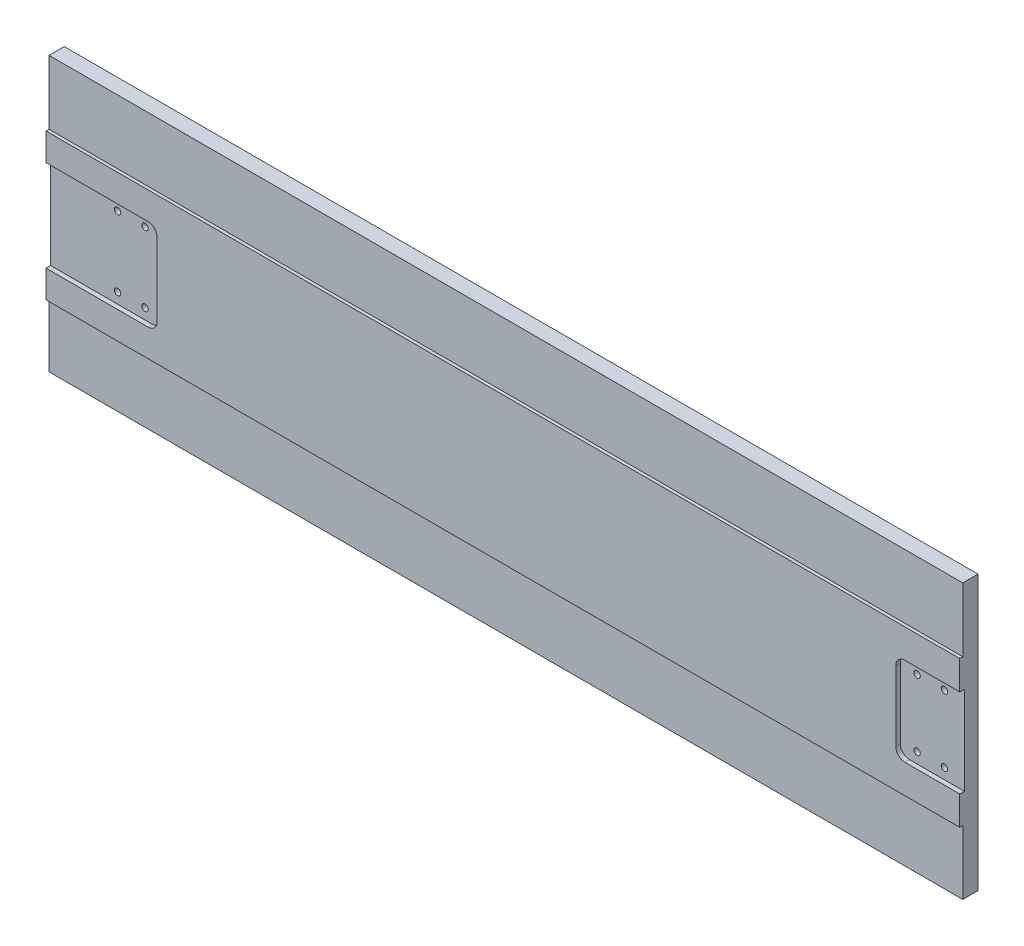
ISO-10303-21;
HEADER;
FILE_DESCRIPTION(('STEP AP214'),'2;1');
FILE_NAME('part.step','',(''),(''),'','','');
FILE_SCHEMA(('AUTOMOTIVE_DESIGN { 1 0 10303 214 1 1 1 1 }'));
ENDSEC;
DATA;
#1=APPLICATION_CONTEXT('core data for automotive mechanical design processes');
#2=APPLICATION_PROTOCOL_DEFINITION('international standard','automotive_design',2000,#1);
#3=PRODUCT_CONTEXT('',#1,'mechanical');
#4=PRODUCT('Part','Part','',(#3));
#5=PRODUCT_RELATED_PRODUCT_CATEGORY('part','',(#4));
#6=PRODUCT_DEFINITION_FORMATION('','',#4);
#7=PRODUCT_DEFINITION_CONTEXT('part definition',#1,'design');
#8=PRODUCT_DEFINITION('design','',#6,#7);
#9=PRODUCT_DEFINITION_SHAPE('','',#8);
#10=(LENGTH_UNIT() NAMED_UNIT(*) SI_UNIT(.MILLI.,.METRE.));
#11=(NAMED_UNIT(*) PLANE_ANGLE_UNIT() SI_UNIT($,.RADIAN.));
#12=(NAMED_UNIT(*) SI_UNIT($,.STERADIAN.) SOLID_ANGLE_UNIT());
#13=UNCERTAINTY_MEASURE_WITH_UNIT(LENGTH_MEASURE(1.E-05),#10,'distance_accuracy_value','');
#14=(GEOMETRIC_REPRESENTATION_CONTEXT(3) GLOBAL_UNCERTAINTY_ASSIGNED_CONTEXT((#13)) GLOBAL_UNIT_ASSIGNED_CONTEXT((#10,
#11,#12)) REPRESENTATION_CONTEXT('',''));
#15=CARTESIAN_POINT('',(0.,0.,0.));
#16=DIRECTION('',(0.,0.,1.));
#17=DIRECTION('',(1.,0.,0.));
#18=AXIS2_PLACEMENT_3D('',#15,#16,#17);
#19=CARTESIAN_POINT('',(0.,270.,10.));
#20=DIRECTION('',(0.,0.,1.));
#21=DIRECTION('',(1.,0.,0.));
#22=AXIS2_PLACEMENT_3D('',#19,#20,#21);
#23=PLANE('',#22);
#24=DIRECTION('',(-1.,0.,0.));
#25=VECTOR('',#24,1.);
#26=CARTESIAN_POINT('',(0.,408.,10.));
#27=LINE('',#26,#25);
#28=CARTESIAN_POINT('',(600.,408.,10.));
#29=VERTEX_POINT('',#28);
#30=CARTESIAN_POINT('',(0.,408.,10.));
#31=VERTEX_POINT('',#30);
#32=EDGE_CURVE('E247',#29,#31,#27,.T.);
#33=ORIENTED_EDGE('',*,*,#32,.F.);
#34=DIRECTION('',(0.,1.,0.));
#35=VECTOR('',#34,1.);
#36=CARTESIAN_POINT('',(600.,450.,10.));
#37=LINE('',#36,#35);
#38=CARTESIAN_POINT('',(600.,450.,10.));
#39=VERTEX_POINT('',#38);
#40=EDGE_CURVE('E248',#29,#39,#37,.T.);
#41=ORIENTED_EDGE('',*,*,#40,.T.);
#42=DIRECTION('',(-1.,0.,0.));
#43=VECTOR('',#42,1.);
#44=CARTESIAN_POINT('',(0.,450.,10.));
#45=LINE('',#44,#43);
#46=CARTESIAN_POINT('',(0.,450.,10.));
#47=VERTEX_POINT('',#46);
#48=EDGE_CURVE('E445',#39,#47,#45,.T.);
#49=ORIENTED_EDGE('',*,*,#48,.T.);
#50=DIRECTION('',(0.,-1.,0.));
#51=VECTOR('',#50,1.);
#52=CARTESIAN_POINT('',(0.,450.,10.));
#53=LINE('',#52,#51);
#54=EDGE_CURVE('E459',#47,#31,#53,.T.);
#55=ORIENTED_EDGE('',*,*,#54,.T.);
#56=EDGE_LOOP('',(#33,#41,#49,#55));
#57=FACE_BOUND('',#56,.T.);
#58=ADVANCED_FACE('F33',(#57),#23,.T.);
#59=CARTESIAN_POINT('',(0.,450.,10.));
#60=DIRECTION('',(1.,0.,0.));
#61=DIRECTION('',(0.,1.,0.));
#62=AXIS2_PLACEMENT_3D('',#59,#60,#61);
#63=PLANE('',#62);
#64=DIRECTION('',(0.,-1.,0.));
#65=VECTOR('',#64,1.);
#66=CARTESIAN_POINT('',(0.,390.,9.));
#67=LINE('',#66,#65);
#68=CARTESIAN_POINT('',(0.,390.,9.));
#69=VERTEX_POINT('',#68);
#70=CARTESIAN_POINT('',(0.,330.,9.));
#71=VERTEX_POINT('',#70);
#72=EDGE_CURVE('E204',#69,#71,#67,.T.);
#73=ORIENTED_EDGE('',*,*,#72,.F.);
#74=DIRECTION('',(0.,0.,1.));
#75=VECTOR('',#74,1.);
#76=CARTESIAN_POINT('',(0.,390.,9.));
#77=LINE('',#76,#75);
#78=CARTESIAN_POINT('',(0.,390.,12.));
#79=VERTEX_POINT('',#78);
#80=EDGE_CURVE('E222',#69,#79,#77,.T.);
#81=ORIENTED_EDGE('',*,*,#80,.T.);
#82=DIRECTION('',(0.,-1.,0.));
#83=VECTOR('',#82,1.);
#84=CARTESIAN_POINT('',(0.,408.,12.));
#85=LINE('',#84,#83);
#86=CARTESIAN_POINT('',(0.,408.,12.));
#87=VERTEX_POINT('',#86);
#88=EDGE_CURVE('E227',#87,#79,#85,.T.);
#89=ORIENTED_EDGE('',*,*,#88,.F.);
#90=DIRECTION('',(0.,0.,-1.));
#91=VECTOR('',#90,1.);
#92=CARTESIAN_POINT('',(0.,408.,12.));
#93=LINE('',#92,#91);
#94=EDGE_CURVE('E238',#87,#31,#93,.T.);
#95=ORIENTED_EDGE('',*,*,#94,.T.);
#96=ORIENTED_EDGE('',*,*,#54,.F.);
#97=DIRECTION('',(0.,0.,-1.));
#98=VECTOR('',#97,1.);
#99=CARTESIAN_POINT('',(0.,450.,10.));
#100=LINE('',#99,#98);
#101=CARTESIAN_POINT('',(0.,450.,0.));
#102=VERTEX_POINT('',#101);
#103=EDGE_CURVE('E450',#47,#102,#100,.T.);
#104=ORIENTED_EDGE('',*,*,#103,.T.);
#105=DIRECTION('',(0.,-1.,0.));
#106=VECTOR('',#105,1.);
#107=CARTESIAN_POINT('',(0.,450.,0.));
#108=LINE('',#107,#106);
#109=CARTESIAN_POINT('',(0.,270.,0.));
#110=VERTEX_POINT('',#109);
#111=EDGE_CURVE('E260',#102,#110,#108,.T.);
#112=ORIENTED_EDGE('',*,*,#111,.T.);
#113=DIRECTION('',(0.,0.,-1.));
#114=VECTOR('',#113,1.);
#115=CARTESIAN_POINT('',(0.,270.,10.));
#116=LINE('',#115,#114);
#117=CARTESIAN_POINT('',(0.,270.,10.));
#118=VERTEX_POINT('',#117);
#119=EDGE_CURVE('E277',#118,#110,#116,.T.);
#120=ORIENTED_EDGE('',*,*,#119,.F.);
#121=CARTESIAN_POINT('',(0.,312.,10.));
#122=VERTEX_POINT('',#121);
#123=EDGE_CURVE('E449',#122,#118,#53,.T.);
#124=ORIENTED_EDGE('',*,*,#123,.F.);
#125=DIRECTION('',(0.,0.,-1.));
#126=VECTOR('',#125,1.);
#127=CARTESIAN_POINT('',(0.,312.,12.));
#128=LINE('',#127,#126);
#129=CARTESIAN_POINT('',(0.,312.,12.));
#130=VERTEX_POINT('',#129);
#131=EDGE_CURVE('E254',#130,#122,#128,.T.);
#132=ORIENTED_EDGE('',*,*,#131,.F.);
#133=CARTESIAN_POINT('',(0.,330.,12.));
#134=VERTEX_POINT('',#133);
#135=EDGE_CURVE('E231',#134,#130,#85,.T.);
#136=ORIENTED_EDGE('',*,*,#135,.F.);
#137=DIRECTION('',(0.,0.,1.));
#138=VECTOR('',#137,1.);
#139=CARTESIAN_POINT('',(0.,330.,9.));
#140=LINE('',#139,#138);
#141=EDGE_CURVE('E215',#71,#134,#140,.T.);
#142=ORIENTED_EDGE('',*,*,#141,.F.);
#143=EDGE_LOOP('',(#73,#81,#89,#95,#96,#104,#112,#120,#124,#132,#136,#142));
#144=FACE_BOUND('',#143,.T.);
#145=ADVANCED_FACE('F329',(#144),#63,.F.);
#146=CARTESIAN_POINT('',(0.,270.,10.));
#147=DIRECTION('',(0.,1.,0.));
#148=DIRECTION('',(0.,0.,1.));
#149=AXIS2_PLACEMENT_3D('',#146,#147,#148);
#150=PLANE('',#149);
#151=DIRECTION('',(1.,0.,0.));
#152=VECTOR('',#151,1.);
#153=CARTESIAN_POINT('',(0.,270.,0.));
#154=LINE('',#153,#152);
#155=CARTESIAN_POINT('',(600.,270.,0.));
#156=VERTEX_POINT('',#155);
#157=EDGE_CURVE('E437',#110,#156,#154,.T.);
#158=ORIENTED_EDGE('',*,*,#157,.T.);
#159=DIRECTION('',(0.,0.,-1.));
#160=VECTOR('',#159,1.);
#161=CARTESIAN_POINT('',(600.,270.,10.));
#162=LINE('',#161,#160);
#163=CARTESIAN_POINT('',(600.,270.,10.));
#164=VERTEX_POINT('',#163);
#165=EDGE_CURVE('E455',#164,#156,#162,.T.);
#166=ORIENTED_EDGE('',*,*,#165,.F.);
#167=DIRECTION('',(1.,0.,0.));
#168=VECTOR('',#167,1.);
#169=CARTESIAN_POINT('',(0.,270.,10.));
#170=LINE('',#169,#168);
#171=EDGE_CURVE('E461',#118,#164,#170,.T.);
#172=ORIENTED_EDGE('',*,*,#171,.F.);
#173=ORIENTED_EDGE('',*,*,#119,.T.);
#174=EDGE_LOOP('',(#158,#166,#172,#173));
#175=FACE_BOUND('',#174,.T.);
#176=ADVANCED_FACE('F491',(#175),#150,.F.);
#177=CARTESIAN_POINT('',(600.,450.,10.));
#178=DIRECTION('',(-1.,0.,0.));
#179=DIRECTION('',(0.,0.,1.));
#180=AXIS2_PLACEMENT_3D('',#177,#178,#179);
#181=PLANE('',#180);
#182=DIRECTION('',(0.,1.,0.));
#183=VECTOR('',#182,1.);
#184=CARTESIAN_POINT('',(600.,331.,9.));
#185=LINE('',#184,#183);
#186=CARTESIAN_POINT('',(600.,331.,9.));
#187=VERTEX_POINT('',#186);
#188=CARTESIAN_POINT('',(600.,389.,9.));
#189=VERTEX_POINT('',#188);
#190=EDGE_CURVE('E181',#187,#189,#185,.T.);
#191=ORIENTED_EDGE('',*,*,#190,.F.);
#192=DIRECTION('',(0.,0.,1.));
#193=VECTOR('',#192,1.);
#194=CARTESIAN_POINT('',(600.,331.,9.));
#195=LINE('',#194,#193);
#196=CARTESIAN_POINT('',(600.,331.,12.));
#197=VERTEX_POINT('',#196);
#198=EDGE_CURVE('E197',#187,#197,#195,.T.);
#199=ORIENTED_EDGE('',*,*,#198,.T.);
#200=DIRECTION('',(0.,1.,0.));
#201=VECTOR('',#200,1.);
#202=CARTESIAN_POINT('',(600.,408.,12.));
#203=LINE('',#202,#201);
#204=CARTESIAN_POINT('',(600.,312.,12.));
#205=VERTEX_POINT('',#204);
#206=EDGE_CURVE('E233',#205,#197,#203,.T.);
#207=ORIENTED_EDGE('',*,*,#206,.F.);
#208=DIRECTION('',(0.,0.,-1.));
#209=VECTOR('',#208,1.);
#210=CARTESIAN_POINT('',(600.,312.,12.));
#211=LINE('',#210,#209);
#212=CARTESIAN_POINT('',(600.,312.,10.));
#213=VERTEX_POINT('',#212);
#214=EDGE_CURVE('E251',#205,#213,#211,.T.);
#215=ORIENTED_EDGE('',*,*,#214,.T.);
#216=EDGE_CURVE('E467',#164,#213,#37,.T.);
#217=ORIENTED_EDGE('',*,*,#216,.F.);
#218=ORIENTED_EDGE('',*,*,#165,.T.);
#219=DIRECTION('',(0.,1.,0.));
#220=VECTOR('',#219,1.);
#221=CARTESIAN_POINT('',(600.,450.,0.));
#222=LINE('',#221,#220);
#223=CARTESIAN_POINT('',(600.,450.,0.));
#224=VERTEX_POINT('',#223);
#225=EDGE_CURVE('E442',#156,#224,#222,.T.);
#226=ORIENTED_EDGE('',*,*,#225,.T.);
#227=DIRECTION('',(0.,0.,-1.));
#228=VECTOR('',#227,1.);
#229=CARTESIAN_POINT('',(600.,450.,10.));
#230=LINE('',#229,#228);
#231=EDGE_CURVE('E452',#39,#224,#230,.T.);
#232=ORIENTED_EDGE('',*,*,#231,.F.);
#233=ORIENTED_EDGE('',*,*,#40,.F.);
#234=DIRECTION('',(0.,0.,-1.));
#235=VECTOR('',#234,1.);
#236=CARTESIAN_POINT('',(600.,408.,12.));
#237=LINE('',#236,#235);
#238=CARTESIAN_POINT('',(600.,408.,12.));
#239=VERTEX_POINT('',#238);
#240=EDGE_CURVE('E255',#239,#29,#237,.T.);
#241=ORIENTED_EDGE('',*,*,#240,.F.);
#242=CARTESIAN_POINT('',(600.,389.,12.));
#243=VERTEX_POINT('',#242);
#244=EDGE_CURVE('E196',#243,#239,#203,.T.);
#245=ORIENTED_EDGE('',*,*,#244,.F.);
#246=DIRECTION('',(0.,0.,1.));
#247=VECTOR('',#246,1.);
#248=CARTESIAN_POINT('',(600.,389.,9.));
#249=LINE('',#248,#247);
#250=EDGE_CURVE('E174',#189,#243,#249,.T.);
#251=ORIENTED_EDGE('',*,*,#250,.F.);
#252=EDGE_LOOP('',(#191,#199,#207,#215,#217,#218,#226,#232,#233,#241,#245,#251));
#253=FACE_BOUND('',#252,.T.);
#254=ADVANCED_FACE('F194',(#253),#181,.F.);
#255=CARTESIAN_POINT('',(0.,450.,10.));
#256=DIRECTION('',(0.,-1.,0.));
#257=DIRECTION('',(0.,0.,-1.));
#258=AXIS2_PLACEMENT_3D('',#255,#256,#257);
#259=PLANE('',#258);
#260=DIRECTION('',(-1.,0.,0.));
#261=VECTOR('',#260,1.);
#262=CARTESIAN_POINT('',(0.,450.,0.));
#263=LINE('',#262,#261);
#264=EDGE_CURVE('E436',#224,#102,#263,.T.);
#265=ORIENTED_EDGE('',*,*,#264,.T.);
#266=ORIENTED_EDGE('',*,*,#103,.F.);
#267=ORIENTED_EDGE('',*,*,#48,.F.);
#268=ORIENTED_EDGE('',*,*,#231,.T.);
#269=EDGE_LOOP('',(#265,#266,#267,#268));
#270=FACE_BOUND('',#269,.T.);
#271=ADVANCED_FACE('F475',(#270),#259,.F.);
#272=DIRECTION('',(1.,0.,0.));
#273=VECTOR('',#272,1.);
#274=CARTESIAN_POINT('',(0.,312.,10.));
#275=LINE('',#274,#273);
#276=EDGE_CURVE('E225',#122,#213,#275,.T.);
#277=ORIENTED_EDGE('',*,*,#276,.F.);
#278=ORIENTED_EDGE('',*,*,#123,.T.);
#279=ORIENTED_EDGE('',*,*,#171,.T.);
#280=ORIENTED_EDGE('',*,*,#216,.T.);
#281=EDGE_LOOP('',(#277,#278,#279,#280));
#282=FACE_BOUND('',#281,.T.);
#283=ADVANCED_FACE('F421',(#282),#23,.T.);
#284=CARTESIAN_POINT('',(0.,270.,0.));
#285=DIRECTION('',(0.,0.,1.));
#286=DIRECTION('',(1.,0.,0.));
#287=AXIS2_PLACEMENT_3D('',#284,#285,#286);
#288=PLANE('',#287);
#289=CARTESIAN_POINT('',(587.,382.,0.));
#290=DIRECTION('',(0.,0.,1.));
#291=DIRECTION('',(1.,0.,0.));
#292=AXIS2_PLACEMENT_3D('',#289,#290,#291);
#293=CIRCLE('',#292,2.09999999999999);
#294=CARTESIAN_POINT('',(589.1,382.,0.));
#295=VERTEX_POINT('',#294);
#296=EDGE_CURVE('E390',#295,#295,#293,.T.);
#297=ORIENTED_EDGE('',*,*,#296,.T.);
#298=EDGE_LOOP('',(#297));
#299=FACE_BOUND('',#298,.T.);
#300=CARTESIAN_POINT('',(569.,382.,0.));
#301=DIRECTION('',(0.,0.,1.));
#302=DIRECTION('',(1.,0.,0.));
#303=AXIS2_PLACEMENT_3D('',#300,#301,#302);
#304=CIRCLE('',#303,2.09999999999999);
#305=CARTESIAN_POINT('',(571.1,382.,0.));
#306=VERTEX_POINT('',#305);
#307=EDGE_CURVE('E384',#306,#306,#304,.T.);
#308=ORIENTED_EDGE('',*,*,#307,.T.);
#309=EDGE_LOOP('',(#308));
#310=FACE_BOUND('',#309,.T.);
#311=CARTESIAN_POINT('',(569.,338.,0.));
#312=DIRECTION('',(0.,0.,1.));
#313=DIRECTION('',(1.,0.,0.));
#314=AXIS2_PLACEMENT_3D('',#311,#312,#313);
#315=CIRCLE('',#314,2.09999999999999);
#316=CARTESIAN_POINT('',(571.1,338.,0.));
#317=VERTEX_POINT('',#316);
#318=EDGE_CURVE('E378',#317,#317,#315,.T.);
#319=ORIENTED_EDGE('',*,*,#318,.T.);
#320=EDGE_LOOP('',(#319));
#321=FACE_BOUND('',#320,.T.);
#322=CARTESIAN_POINT('',(587.,338.,0.));
#323=DIRECTION('',(0.,0.,1.));
#324=DIRECTION('',(1.,0.,0.));
#325=AXIS2_PLACEMENT_3D('',#322,#323,#324);
#326=CIRCLE('',#325,2.09999999999999);
#327=CARTESIAN_POINT('',(589.1,338.,0.));
#328=VERTEX_POINT('',#327);
#329=EDGE_CURVE('E372',#328,#328,#326,.T.);
#330=ORIENTED_EDGE('',*,*,#329,.T.);
#331=EDGE_LOOP('',(#330));
#332=FACE_BOUND('',#331,.T.);
#333=CARTESIAN_POINT('',(62.,383.,0.));
#334=DIRECTION('',(0.,0.,1.));
#335=DIRECTION('',(1.,0.,0.));
#336=AXIS2_PLACEMENT_3D('',#333,#334,#335);
#337=CIRCLE('',#336,2.09999999999999);
#338=CARTESIAN_POINT('',(64.1,383.,0.));
#339=VERTEX_POINT('',#338);
#340=EDGE_CURVE('E366',#339,#339,#337,.T.);
#341=ORIENTED_EDGE('',*,*,#340,.T.);
#342=EDGE_LOOP('',(#341));
#343=FACE_BOUND('',#342,.T.);
#344=CARTESIAN_POINT('',(44.,383.,0.));
#345=DIRECTION('',(0.,0.,1.));
#346=DIRECTION('',(1.,0.,0.));
#347=AXIS2_PLACEMENT_3D('',#344,#345,#346);
#348=CIRCLE('',#347,2.1);
#349=CARTESIAN_POINT('',(46.1,383.,0.));
#350=VERTEX_POINT('',#349);
#351=EDGE_CURVE('E360',#350,#350,#348,.T.);
#352=ORIENTED_EDGE('',*,*,#351,.T.);
#353=EDGE_LOOP('',(#352));
#354=FACE_BOUND('',#353,.T.);
#355=CARTESIAN_POINT('',(62.,337.,0.));
#356=DIRECTION('',(0.,0.,1.));
#357=DIRECTION('',(1.,0.,0.));
#358=AXIS2_PLACEMENT_3D('',#355,#356,#357);
#359=CIRCLE('',#358,2.1);
#360=CARTESIAN_POINT('',(64.1,337.,0.));
#361=VERTEX_POINT('',#360);
#362=EDGE_CURVE('E354',#361,#361,#359,.T.);
#363=ORIENTED_EDGE('',*,*,#362,.T.);
#364=EDGE_LOOP('',(#363));
#365=FACE_BOUND('',#364,.T.);
#366=CARTESIAN_POINT('',(44.,337.,0.));
#367=DIRECTION('',(0.,0.,1.));
#368=DIRECTION('',(1.,0.,0.));
#369=AXIS2_PLACEMENT_3D('',#366,#367,#368);
#370=CIRCLE('',#369,2.1);
#371=CARTESIAN_POINT('',(46.1,337.,0.));
#372=VERTEX_POINT('',#371);
#373=EDGE_CURVE('E346',#372,#372,#370,.T.);
#374=ORIENTED_EDGE('',*,*,#373,.T.);
#375=EDGE_LOOP('',(#374));
#376=FACE_BOUND('',#375,.T.);
#377=ORIENTED_EDGE('',*,*,#111,.F.);
#378=ORIENTED_EDGE('',*,*,#264,.F.);
#379=ORIENTED_EDGE('',*,*,#225,.F.);
#380=ORIENTED_EDGE('',*,*,#157,.F.);
#381=EDGE_LOOP('',(#377,#378,#379,#380));
#382=FACE_BOUND('',#381,.T.);
#383=ADVANCED_FACE('F418',(#299,#310,#321,#332,#343,#354,#365,#376,#382),#288,.F.);
#384=CARTESIAN_POINT('',(0.,312.,12.));
#385=DIRECTION('',(0.,1.,0.));
#386=DIRECTION('',(0.,0.,1.));
#387=AXIS2_PLACEMENT_3D('',#384,#385,#386);
#388=PLANE('',#387);
#389=ORIENTED_EDGE('',*,*,#276,.T.);
#390=ORIENTED_EDGE('',*,*,#214,.F.);
#391=DIRECTION('',(1.,0.,0.));
#392=VECTOR('',#391,1.);
#393=CARTESIAN_POINT('',(0.,312.,12.));
#394=LINE('',#393,#392);
#395=EDGE_CURVE('E230',#130,#205,#394,.T.);
#396=ORIENTED_EDGE('',*,*,#395,.F.);
#397=ORIENTED_EDGE('',*,*,#131,.T.);
#398=EDGE_LOOP('',(#389,#390,#396,#397));
#399=FACE_BOUND('',#398,.T.);
#400=ADVANCED_FACE('F336',(#399),#388,.F.);
#401=CARTESIAN_POINT('',(0.,408.,12.));
#402=DIRECTION('',(0.,-1.,0.));
#403=DIRECTION('',(1.,0.,0.));
#404=AXIS2_PLACEMENT_3D('',#401,#402,#403);
#405=PLANE('',#404);
#406=ORIENTED_EDGE('',*,*,#32,.T.);
#407=ORIENTED_EDGE('',*,*,#94,.F.);
#408=DIRECTION('',(-1.,0.,0.));
#409=VECTOR('',#408,1.);
#410=CARTESIAN_POINT('',(0.,408.,12.));
#411=LINE('',#410,#409);
#412=EDGE_CURVE('E236',#239,#87,#411,.T.);
#413=ORIENTED_EDGE('',*,*,#412,.F.);
#414=ORIENTED_EDGE('',*,*,#240,.T.);
#415=EDGE_LOOP('',(#406,#407,#413,#414));
#416=FACE_BOUND('',#415,.T.);
#417=ADVANCED_FACE('F477',(#416),#405,.F.);
#418=CARTESIAN_POINT('',(0.,0.,12.));
#419=DIRECTION('',(0.,0.,1.));
#420=DIRECTION('',(1.,0.,0.));
#421=AXIS2_PLACEMENT_3D('',#418,#419,#420);
#422=PLANE('',#421);
#423=DIRECTION('',(1.,0.,0.));
#424=VECTOR('',#423,1.);
#425=CARTESIAN_POINT('',(600.,331.,12.));
#426=LINE('',#425,#424);
#427=CARTESIAN_POINT('',(564.,331.,12.));
#428=VERTEX_POINT('',#427);
#429=EDGE_CURVE('E191',#428,#197,#426,.T.);
#430=ORIENTED_EDGE('',*,*,#429,.F.);
#431=CARTESIAN_POINT('',(564.,337.,12.));
#432=DIRECTION('',(0.,0.,1.));
#433=DIRECTION('',(1.,0.,0.));
#434=AXIS2_PLACEMENT_3D('',#431,#432,#433);
#435=CIRCLE('',#434,6.);
#436=CARTESIAN_POINT('',(558.,337.,12.));
#437=VERTEX_POINT('',#436);
#438=EDGE_CURVE('E299',#428,#437,#435,.F.);
#439=ORIENTED_EDGE('',*,*,#438,.T.);
#440=DIRECTION('',(0.,-1.,0.));
#441=VECTOR('',#440,1.);
#442=CARTESIAN_POINT('',(558.,331.,12.));
#443=LINE('',#442,#441);
#444=CARTESIAN_POINT('',(558.,383.,12.));
#445=VERTEX_POINT('',#444);
#446=EDGE_CURVE('E342',#445,#437,#443,.T.);
#447=ORIENTED_EDGE('',*,*,#446,.F.);
#448=CARTESIAN_POINT('',(564.,383.,12.));
#449=DIRECTION('',(0.,0.,1.));
#450=DIRECTION('',(1.,0.,0.));
#451=AXIS2_PLACEMENT_3D('',#448,#449,#450);
#452=CIRCLE('',#451,6.);
#453=CARTESIAN_POINT('',(564.,389.,12.));
#454=VERTEX_POINT('',#453);
#455=EDGE_CURVE('E301',#445,#454,#452,.F.);
#456=ORIENTED_EDGE('',*,*,#455,.T.);
#457=DIRECTION('',(-1.,0.,0.));
#458=VECTOR('',#457,1.);
#459=CARTESIAN_POINT('',(600.,389.,12.));
#460=LINE('',#459,#458);
#461=EDGE_CURVE('E343',#243,#454,#460,.T.);
#462=ORIENTED_EDGE('',*,*,#461,.F.);
#463=ORIENTED_EDGE('',*,*,#244,.T.);
#464=ORIENTED_EDGE('',*,*,#412,.T.);
#465=ORIENTED_EDGE('',*,*,#88,.T.);
#466=DIRECTION('',(-1.,0.,0.));
#467=VECTOR('',#466,1.);
#468=CARTESIAN_POINT('',(0.,390.,12.));
#469=LINE('',#468,#467);
#470=CARTESIAN_POINT('',(67.,390.,12.));
#471=VERTEX_POINT('',#470);
#472=EDGE_CURVE('E208',#471,#79,#469,.T.);
#473=ORIENTED_EDGE('',*,*,#472,.F.);
#474=CARTESIAN_POINT('',(67.,384.,12.));
#475=DIRECTION('',(0.,0.,1.));
#476=DIRECTION('',(1.,0.,0.));
#477=AXIS2_PLACEMENT_3D('',#474,#475,#476);
#478=CIRCLE('',#477,6.);
#479=CARTESIAN_POINT('',(73.,384.,12.));
#480=VERTEX_POINT('',#479);
#481=EDGE_CURVE('E11',#471,#480,#478,.F.);
#482=ORIENTED_EDGE('',*,*,#481,.T.);
#483=DIRECTION('',(0.,1.,0.));
#484=VECTOR('',#483,1.);
#485=CARTESIAN_POINT('',(73.,390.,12.));
#486=LINE('',#485,#484);
#487=CARTESIAN_POINT('',(73.,336.,12.));
#488=VERTEX_POINT('',#487);
#489=EDGE_CURVE('E218',#488,#480,#486,.T.);
#490=ORIENTED_EDGE('',*,*,#489,.F.);
#491=CARTESIAN_POINT('',(67.,336.,12.));
#492=DIRECTION('',(0.,0.,1.));
#493=DIRECTION('',(1.,0.,0.));
#494=AXIS2_PLACEMENT_3D('',#491,#492,#493);
#495=CIRCLE('',#494,6.);
#496=CARTESIAN_POINT('',(67.,330.,12.));
#497=VERTEX_POINT('',#496);
#498=EDGE_CURVE('E41',#488,#497,#495,.F.);
#499=ORIENTED_EDGE('',*,*,#498,.T.);
#500=DIRECTION('',(1.,0.,0.));
#501=VECTOR('',#500,1.);
#502=CARTESIAN_POINT('',(0.,330.,12.));
#503=LINE('',#502,#501);
#504=EDGE_CURVE('E199',#134,#497,#503,.T.);
#505=ORIENTED_EDGE('',*,*,#504,.F.);
#506=ORIENTED_EDGE('',*,*,#135,.T.);
#507=ORIENTED_EDGE('',*,*,#395,.T.);
#508=ORIENTED_EDGE('',*,*,#206,.T.);
#509=EDGE_LOOP('',(#430,#439,#447,#456,#462,#463,#464,#465,#473,#482,#490,#499,#505,#506,#507,#508));
#510=FACE_BOUND('',#509,.T.);
#511=ADVANCED_FACE('F306',(#510),#422,.T.);
#512=CARTESIAN_POINT('',(0.,390.,9.));
#513=DIRECTION('',(0.,1.,0.));
#514=DIRECTION('',(0.,0.,1.));
#515=AXIS2_PLACEMENT_3D('',#512,#513,#514);
#516=PLANE('',#515);
#517=DIRECTION('',(-1.,0.,0.));
#518=VECTOR('',#517,1.);
#519=CARTESIAN_POINT('',(0.,390.,9.));
#520=LINE('',#519,#518);
#521=CARTESIAN_POINT('',(67.,390.,9.));
#522=VERTEX_POINT('',#521);
#523=EDGE_CURVE('E213',#522,#69,#520,.T.);
#524=ORIENTED_EDGE('',*,*,#523,.F.);
#525=DIRECTION('',(0.,0.,1.));
#526=VECTOR('',#525,1.);
#527=CARTESIAN_POINT('',(67.,390.,12.));
#528=LINE('',#527,#526);
#529=EDGE_CURVE('E297',#522,#471,#528,.T.);
#530=ORIENTED_EDGE('',*,*,#529,.T.);
#531=ORIENTED_EDGE('',*,*,#472,.T.);
#532=ORIENTED_EDGE('',*,*,#80,.F.);
#533=EDGE_LOOP('',(#524,#530,#531,#532));
#534=FACE_BOUND('',#533,.T.);
#535=ADVANCED_FACE('F322',(#534),#516,.F.);
#536=CARTESIAN_POINT('',(73.,390.,9.));
#537=DIRECTION('',(1.,0.,0.));
#538=DIRECTION('',(0.,0.,-1.));
#539=AXIS2_PLACEMENT_3D('',#536,#537,#538);
#540=PLANE('',#539);
#541=DIRECTION('',(0.,1.,0.));
#542=VECTOR('',#541,1.);
#543=CARTESIAN_POINT('',(73.,390.,9.));
#544=LINE('',#543,#542);
#545=CARTESIAN_POINT('',(73.,336.,9.));
#546=VERTEX_POINT('',#545);
#547=CARTESIAN_POINT('',(73.,384.,9.));
#548=VERTEX_POINT('',#547);
#549=EDGE_CURVE('E211',#546,#548,#544,.T.);
#550=ORIENTED_EDGE('',*,*,#549,.F.);
#551=DIRECTION('',(0.,0.,1.));
#552=VECTOR('',#551,1.);
#553=CARTESIAN_POINT('',(73.,336.,12.));
#554=LINE('',#553,#552);
#555=EDGE_CURVE('E289',#546,#488,#554,.T.);
#556=ORIENTED_EDGE('',*,*,#555,.T.);
#557=ORIENTED_EDGE('',*,*,#489,.T.);
#558=DIRECTION('',(0.,0.,1.));
#559=VECTOR('',#558,1.);
#560=CARTESIAN_POINT('',(73.,384.,9.));
#561=LINE('',#560,#559);
#562=EDGE_CURVE('E287',#480,#548,#561,.F.);
#563=ORIENTED_EDGE('',*,*,#562,.T.);
#564=EDGE_LOOP('',(#550,#556,#557,#563));
#565=FACE_BOUND('',#564,.T.);
#566=ADVANCED_FACE('F319',(#565),#540,.F.);
#567=CARTESIAN_POINT('',(0.,330.,9.));
#568=DIRECTION('',(0.,-1.,0.));
#569=DIRECTION('',(0.,0.,-1.));
#570=AXIS2_PLACEMENT_3D('',#567,#568,#569);
#571=PLANE('',#570);
#572=ORIENTED_EDGE('',*,*,#504,.T.);
#573=DIRECTION('',(0.,0.,1.));
#574=VECTOR('',#573,1.);
#575=CARTESIAN_POINT('',(67.,330.,9.));
#576=LINE('',#575,#574);
#577=CARTESIAN_POINT('',(67.,330.,9.));
#578=VERTEX_POINT('',#577);
#579=EDGE_CURVE('E292',#497,#578,#576,.F.);
#580=ORIENTED_EDGE('',*,*,#579,.T.);
#581=DIRECTION('',(1.,0.,0.));
#582=VECTOR('',#581,1.);
#583=CARTESIAN_POINT('',(0.,330.,9.));
#584=LINE('',#583,#582);
#585=EDGE_CURVE('E207',#71,#578,#584,.T.);
#586=ORIENTED_EDGE('',*,*,#585,.F.);
#587=ORIENTED_EDGE('',*,*,#141,.T.);
#588=EDGE_LOOP('',(#572,#580,#586,#587));
#589=FACE_BOUND('',#588,.T.);
#590=ADVANCED_FACE('F312',(#589),#571,.F.);
#591=CARTESIAN_POINT('',(0.,0.,9.));
#592=DIRECTION('',(0.,0.,1.));
#593=DIRECTION('',(1.,0.,0.));
#594=AXIS2_PLACEMENT_3D('',#591,#592,#593);
#595=PLANE('',#594);
#596=CARTESIAN_POINT('',(62.,383.,9.));
#597=DIRECTION('',(0.,0.,1.));
#598=DIRECTION('',(1.,0.,0.));
#599=AXIS2_PLACEMENT_3D('',#596,#597,#598);
#600=CIRCLE('',#599,2.09999999999999);
#601=CARTESIAN_POINT('',(64.1,383.,9.));
#602=VERTEX_POINT('',#601);
#603=EDGE_CURVE('E369',#602,#602,#600,.T.);
#604=ORIENTED_EDGE('',*,*,#603,.F.);
#605=EDGE_LOOP('',(#604));
#606=FACE_BOUND('',#605,.T.);
#607=CARTESIAN_POINT('',(44.,383.,9.));
#608=DIRECTION('',(0.,0.,1.));
#609=DIRECTION('',(1.,0.,0.));
#610=AXIS2_PLACEMENT_3D('',#607,#608,#609);
#611=CIRCLE('',#610,2.09999999999998);
#612=CARTESIAN_POINT('',(46.1,383.,9.));
#613=VERTEX_POINT('',#612);
#614=EDGE_CURVE('E363',#613,#613,#611,.T.);
#615=ORIENTED_EDGE('',*,*,#614,.F.);
#616=EDGE_LOOP('',(#615));
#617=FACE_BOUND('',#616,.T.);
#618=CARTESIAN_POINT('',(62.,337.,9.));
#619=DIRECTION('',(0.,0.,1.));
#620=DIRECTION('',(1.,0.,0.));
#621=AXIS2_PLACEMENT_3D('',#618,#619,#620);
#622=CIRCLE('',#621,2.09999999999998);
#623=CARTESIAN_POINT('',(64.1,337.,9.));
#624=VERTEX_POINT('',#623);
#625=EDGE_CURVE('E357',#624,#624,#622,.T.);
#626=ORIENTED_EDGE('',*,*,#625,.F.);
#627=EDGE_LOOP('',(#626));
#628=FACE_BOUND('',#627,.T.);
#629=CARTESIAN_POINT('',(44.,337.,9.));
#630=DIRECTION('',(0.,0.,1.));
#631=DIRECTION('',(1.,0.,0.));
#632=AXIS2_PLACEMENT_3D('',#629,#630,#631);
#633=CIRCLE('',#632,2.09999999999999);
#634=CARTESIAN_POINT('',(46.1,337.,9.));
#635=VERTEX_POINT('',#634);
#636=EDGE_CURVE('E351',#635,#635,#633,.T.);
#637=ORIENTED_EDGE('',*,*,#636,.F.);
#638=EDGE_LOOP('',(#637));
#639=FACE_BOUND('',#638,.T.);
#640=ORIENTED_EDGE('',*,*,#585,.T.);
#641=CARTESIAN_POINT('',(67.,336.,9.));
#642=DIRECTION('',(0.,0.,1.));
#643=DIRECTION('',(1.,0.,0.));
#644=AXIS2_PLACEMENT_3D('',#641,#642,#643);
#645=CIRCLE('',#644,6.);
#646=EDGE_CURVE('E295',#578,#546,#645,.T.);
#647=ORIENTED_EDGE('',*,*,#646,.T.);
#648=ORIENTED_EDGE('',*,*,#549,.T.);
#649=CARTESIAN_POINT('',(67.,384.,9.));
#650=DIRECTION('',(0.,0.,1.));
#651=DIRECTION('',(1.,0.,0.));
#652=AXIS2_PLACEMENT_3D('',#649,#650,#651);
#653=CIRCLE('',#652,6.);
#654=EDGE_CURVE('E54',#548,#522,#653,.T.);
#655=ORIENTED_EDGE('',*,*,#654,.T.);
#656=ORIENTED_EDGE('',*,*,#523,.T.);
#657=ORIENTED_EDGE('',*,*,#72,.T.);
#658=EDGE_LOOP('',(#640,#647,#648,#655,#656,#657));
#659=FACE_BOUND('',#658,.T.);
#660=ADVANCED_FACE('F317',(#606,#617,#628,#639,#659),#595,.T.);
#661=CARTESIAN_POINT('',(600.,331.,9.));
#662=DIRECTION('',(0.,-1.,0.));
#663=DIRECTION('',(0.,0.,-1.));
#664=AXIS2_PLACEMENT_3D('',#661,#662,#663);
#665=PLANE('',#664);
#666=DIRECTION('',(1.,0.,0.));
#667=VECTOR('',#666,1.);
#668=CARTESIAN_POINT('',(600.,331.,9.));
#669=LINE('',#668,#667);
#670=CARTESIAN_POINT('',(564.,331.,9.));
#671=VERTEX_POINT('',#670);
#672=EDGE_CURVE('E187',#671,#187,#669,.T.);
#673=ORIENTED_EDGE('',*,*,#672,.F.);
#674=DIRECTION('',(0.,0.,1.));
#675=VECTOR('',#674,1.);
#676=CARTESIAN_POINT('',(564.,331.,12.));
#677=LINE('',#676,#675);
#678=EDGE_CURVE('E273',#671,#428,#677,.T.);
#679=ORIENTED_EDGE('',*,*,#678,.T.);
#680=ORIENTED_EDGE('',*,*,#429,.T.);
#681=ORIENTED_EDGE('',*,*,#198,.F.);
#682=EDGE_LOOP('',(#673,#679,#680,#681));
#683=FACE_BOUND('',#682,.T.);
#684=ADVANCED_FACE('F534',(#683),#665,.F.);
#685=CARTESIAN_POINT('',(558.,331.,9.));
#686=DIRECTION('',(-1.,0.,0.));
#687=DIRECTION('',(0.,0.,1.));
#688=AXIS2_PLACEMENT_3D('',#685,#686,#687);
#689=PLANE('',#688);
#690=ORIENTED_EDGE('',*,*,#446,.T.);
#691=DIRECTION('',(0.,0.,1.));
#692=VECTOR('',#691,1.);
#693=CARTESIAN_POINT('',(558.,337.,9.));
#694=LINE('',#693,#692);
#695=CARTESIAN_POINT('',(558.,337.,9.));
#696=VERTEX_POINT('',#695);
#697=EDGE_CURVE('E280',#437,#696,#694,.F.);
#698=ORIENTED_EDGE('',*,*,#697,.T.);
#699=DIRECTION('',(0.,-1.,0.));
#700=VECTOR('',#699,1.);
#701=CARTESIAN_POINT('',(558.,331.,9.));
#702=LINE('',#701,#700);
#703=CARTESIAN_POINT('',(558.,383.,9.));
#704=VERTEX_POINT('',#703);
#705=EDGE_CURVE('E180',#704,#696,#702,.T.);
#706=ORIENTED_EDGE('',*,*,#705,.F.);
#707=DIRECTION('',(0.,0.,1.));
#708=VECTOR('',#707,1.);
#709=CARTESIAN_POINT('',(558.,383.,12.));
#710=LINE('',#709,#708);
#711=EDGE_CURVE('E276',#704,#445,#710,.T.);
#712=ORIENTED_EDGE('',*,*,#711,.T.);
#713=EDGE_LOOP('',(#690,#698,#706,#712));
#714=FACE_BOUND('',#713,.T.);
#715=ADVANCED_FACE('F537',(#714),#689,.F.);
#716=CARTESIAN_POINT('',(600.,389.,9.));
#717=DIRECTION('',(0.,1.,0.));
#718=DIRECTION('',(0.,0.,1.));
#719=AXIS2_PLACEMENT_3D('',#716,#717,#718);
#720=PLANE('',#719);
#721=ORIENTED_EDGE('',*,*,#461,.T.);
#722=DIRECTION('',(0.,0.,1.));
#723=VECTOR('',#722,1.);
#724=CARTESIAN_POINT('',(564.,389.,9.));
#725=LINE('',#724,#723);
#726=CARTESIAN_POINT('',(564.,389.,9.));
#727=VERTEX_POINT('',#726);
#728=EDGE_CURVE('E177',#454,#727,#725,.F.);
#729=ORIENTED_EDGE('',*,*,#728,.T.);
#730=DIRECTION('',(-1.,0.,0.));
#731=VECTOR('',#730,1.);
#732=CARTESIAN_POINT('',(600.,389.,9.));
#733=LINE('',#732,#731);
#734=EDGE_CURVE('E169',#189,#727,#733,.T.);
#735=ORIENTED_EDGE('',*,*,#734,.F.);
#736=ORIENTED_EDGE('',*,*,#250,.T.);
#737=EDGE_LOOP('',(#721,#729,#735,#736));
#738=FACE_BOUND('',#737,.T.);
#739=ADVANCED_FACE('F172',(#738),#720,.F.);
#740=CARTESIAN_POINT('',(0.,0.,9.));
#741=DIRECTION('',(0.,0.,1.));
#742=DIRECTION('',(1.,0.,0.));
#743=AXIS2_PLACEMENT_3D('',#740,#741,#742);
#744=PLANE('',#743);
#745=CARTESIAN_POINT('',(587.,382.,9.));
#746=DIRECTION('',(0.,0.,1.));
#747=DIRECTION('',(1.,0.,0.));
#748=AXIS2_PLACEMENT_3D('',#745,#746,#747);
#749=CIRCLE('',#748,2.09999999999999);
#750=CARTESIAN_POINT('',(589.1,382.,9.));
#751=VERTEX_POINT('',#750);
#752=EDGE_CURVE('E393',#751,#751,#749,.T.);
#753=ORIENTED_EDGE('',*,*,#752,.F.);
#754=EDGE_LOOP('',(#753));
#755=FACE_BOUND('',#754,.T.);
#756=CARTESIAN_POINT('',(569.,382.,9.));
#757=DIRECTION('',(0.,0.,1.));
#758=DIRECTION('',(1.,0.,0.));
#759=AXIS2_PLACEMENT_3D('',#756,#757,#758);
#760=CIRCLE('',#759,2.09999999999999);
#761=CARTESIAN_POINT('',(571.1,382.,9.));
#762=VERTEX_POINT('',#761);
#763=EDGE_CURVE('E387',#762,#762,#760,.T.);
#764=ORIENTED_EDGE('',*,*,#763,.F.);
#765=EDGE_LOOP('',(#764));
#766=FACE_BOUND('',#765,.T.);
#767=CARTESIAN_POINT('',(569.,338.,9.));
#768=DIRECTION('',(0.,0.,1.));
#769=DIRECTION('',(1.,0.,0.));
#770=AXIS2_PLACEMENT_3D('',#767,#768,#769);
#771=CIRCLE('',#770,2.09999999999999);
#772=CARTESIAN_POINT('',(571.1,338.,9.));
#773=VERTEX_POINT('',#772);
#774=EDGE_CURVE('E381',#773,#773,#771,.T.);
#775=ORIENTED_EDGE('',*,*,#774,.F.);
#776=EDGE_LOOP('',(#775));
#777=FACE_BOUND('',#776,.T.);
#778=CARTESIAN_POINT('',(587.,338.,9.));
#779=DIRECTION('',(0.,0.,1.));
#780=DIRECTION('',(1.,0.,0.));
#781=AXIS2_PLACEMENT_3D('',#778,#779,#780);
#782=CIRCLE('',#781,2.09999999999999);
#783=CARTESIAN_POINT('',(589.1,338.,9.));
#784=VERTEX_POINT('',#783);
#785=EDGE_CURVE('E375',#784,#784,#782,.T.);
#786=ORIENTED_EDGE('',*,*,#785,.F.);
#787=EDGE_LOOP('',(#786));
#788=FACE_BOUND('',#787,.T.);
#789=ORIENTED_EDGE('',*,*,#705,.T.);
#790=CARTESIAN_POINT('',(564.,337.,9.));
#791=DIRECTION('',(0.,0.,1.));
#792=DIRECTION('',(1.,0.,0.));
#793=AXIS2_PLACEMENT_3D('',#790,#791,#792);
#794=CIRCLE('',#793,6.);
#795=EDGE_CURVE('E284',#696,#671,#794,.T.);
#796=ORIENTED_EDGE('',*,*,#795,.T.);
#797=ORIENTED_EDGE('',*,*,#672,.T.);
#798=ORIENTED_EDGE('',*,*,#190,.T.);
#799=ORIENTED_EDGE('',*,*,#734,.T.);
#800=CARTESIAN_POINT('',(564.,383.,9.));
#801=DIRECTION('',(0.,0.,1.));
#802=DIRECTION('',(1.,0.,0.));
#803=AXIS2_PLACEMENT_3D('',#800,#801,#802);
#804=CIRCLE('',#803,6.);
#805=EDGE_CURVE('E282',#727,#704,#804,.T.);
#806=ORIENTED_EDGE('',*,*,#805,.T.);
#807=EDGE_LOOP('',(#789,#796,#797,#798,#799,#806));
#808=FACE_BOUND('',#807,.T.);
#809=ADVANCED_FACE('F185',(#755,#766,#777,#788,#808),#744,.T.);
#810=CARTESIAN_POINT('',(564.,337.,9.));
#811=DIRECTION('',(0.,0.,-1.));
#812=DIRECTION('',(-1.,0.,0.));
#813=AXIS2_PLACEMENT_3D('',#810,#811,#812);
#814=CYLINDRICAL_SURFACE('',#813,6.);
#815=ORIENTED_EDGE('',*,*,#795,.F.);
#816=ORIENTED_EDGE('',*,*,#697,.F.);
#817=ORIENTED_EDGE('',*,*,#438,.F.);
#818=ORIENTED_EDGE('',*,*,#678,.F.);
#819=EDGE_LOOP('',(#815,#816,#817,#818));
#820=FACE_BOUND('',#819,.T.);
#821=ADVANCED_FACE('F402',(#820),#814,.F.);
#822=CARTESIAN_POINT('',(564.,383.,9.));
#823=DIRECTION('',(0.,0.,-1.));
#824=DIRECTION('',(-1.,0.,0.));
#825=AXIS2_PLACEMENT_3D('',#822,#823,#824);
#826=CYLINDRICAL_SURFACE('',#825,6.);
#827=ORIENTED_EDGE('',*,*,#805,.F.);
#828=ORIENTED_EDGE('',*,*,#728,.F.);
#829=ORIENTED_EDGE('',*,*,#455,.F.);
#830=ORIENTED_EDGE('',*,*,#711,.F.);
#831=EDGE_LOOP('',(#827,#828,#829,#830));
#832=FACE_BOUND('',#831,.T.);
#833=ADVANCED_FACE('F510',(#832),#826,.F.);
#834=CARTESIAN_POINT('',(67.,336.,9.));
#835=DIRECTION('',(0.,0.,-1.));
#836=DIRECTION('',(-1.,0.,0.));
#837=AXIS2_PLACEMENT_3D('',#834,#835,#836);
#838=CYLINDRICAL_SURFACE('',#837,6.);
#839=ORIENTED_EDGE('',*,*,#646,.F.);
#840=ORIENTED_EDGE('',*,*,#579,.F.);
#841=ORIENTED_EDGE('',*,*,#498,.F.);
#842=ORIENTED_EDGE('',*,*,#555,.F.);
#843=EDGE_LOOP('',(#839,#840,#841,#842));
#844=FACE_BOUND('',#843,.T.);
#845=ADVANCED_FACE('F315',(#844),#838,.F.);
#846=CARTESIAN_POINT('',(67.,384.,9.));
#847=DIRECTION('',(0.,0.,-1.));
#848=DIRECTION('',(-1.,0.,0.));
#849=AXIS2_PLACEMENT_3D('',#846,#847,#848);
#850=CYLINDRICAL_SURFACE('',#849,6.);
#851=ORIENTED_EDGE('',*,*,#654,.F.);
#852=ORIENTED_EDGE('',*,*,#562,.F.);
#853=ORIENTED_EDGE('',*,*,#481,.F.);
#854=ORIENTED_EDGE('',*,*,#529,.F.);
#855=EDGE_LOOP('',(#851,#852,#853,#854));
#856=FACE_BOUND('',#855,.T.);
#857=ADVANCED_FACE('F35',(#856),#850,.F.);
#858=CARTESIAN_POINT('',(44.,337.,9.));
#859=DIRECTION('',(0.,0.,1.));
#860=DIRECTION('',(1.,0.,0.));
#861=AXIS2_PLACEMENT_3D('',#858,#859,#860);
#862=CYLINDRICAL_SURFACE('',#861,2.09999999999999);
#863=ORIENTED_EDGE('',*,*,#373,.F.);
#864=EDGE_LOOP('',(#863));
#865=FACE_BOUND('',#864,.T.);
#866=ORIENTED_EDGE('',*,*,#636,.T.);
#867=EDGE_LOOP('',(#866));
#868=FACE_BOUND('',#867,.T.);
#869=ADVANCED_FACE('F518',(#865,#868),#862,.F.);
#870=CARTESIAN_POINT('',(62.,337.,9.));
#871=DIRECTION('',(0.,0.,1.));
#872=DIRECTION('',(1.,0.,0.));
#873=AXIS2_PLACEMENT_3D('',#870,#871,#872);
#874=CYLINDRICAL_SURFACE('',#873,2.09999999999999);
#875=ORIENTED_EDGE('',*,*,#362,.F.);
#876=EDGE_LOOP('',(#875));
#877=FACE_BOUND('',#876,.T.);
#878=ORIENTED_EDGE('',*,*,#625,.T.);
#879=EDGE_LOOP('',(#878));
#880=FACE_BOUND('',#879,.T.);
#881=ADVANCED_FACE('F522',(#877,#880),#874,.F.);
#882=CARTESIAN_POINT('',(44.,383.,9.));
#883=DIRECTION('',(0.,0.,1.));
#884=DIRECTION('',(1.,0.,0.));
#885=AXIS2_PLACEMENT_3D('',#882,#883,#884);
#886=CYLINDRICAL_SURFACE('',#885,2.09999999999999);
#887=ORIENTED_EDGE('',*,*,#351,.F.);
#888=EDGE_LOOP('',(#887));
#889=FACE_BOUND('',#888,.T.);
#890=ORIENTED_EDGE('',*,*,#614,.T.);
#891=EDGE_LOOP('',(#890));
#892=FACE_BOUND('',#891,.T.);
#893=ADVANCED_FACE('F528',(#889,#892),#886,.F.);
#894=CARTESIAN_POINT('',(62.,383.,9.));
#895=DIRECTION('',(0.,0.,1.));
#896=DIRECTION('',(1.,0.,0.));
#897=AXIS2_PLACEMENT_3D('',#894,#895,#896);
#898=CYLINDRICAL_SURFACE('',#897,2.09999999999999);
#899=ORIENTED_EDGE('',*,*,#340,.F.);
#900=EDGE_LOOP('',(#899));
#901=FACE_BOUND('',#900,.T.);
#902=ORIENTED_EDGE('',*,*,#603,.T.);
#903=EDGE_LOOP('',(#902));
#904=FACE_BOUND('',#903,.T.);
#905=ADVANCED_FACE('F414',(#901,#904),#898,.F.);
#906=CARTESIAN_POINT('',(587.,338.,9.));
#907=DIRECTION('',(0.,0.,1.));
#908=DIRECTION('',(1.,0.,0.));
#909=AXIS2_PLACEMENT_3D('',#906,#907,#908);
#910=CYLINDRICAL_SURFACE('',#909,2.09999999999999);
#911=ORIENTED_EDGE('',*,*,#785,.T.);
#912=EDGE_LOOP('',(#911));
#913=FACE_BOUND('',#912,.T.);
#914=ORIENTED_EDGE('',*,*,#329,.F.);
#915=EDGE_LOOP('',(#914));
#916=FACE_BOUND('',#915,.T.);
#917=ADVANCED_FACE('F410',(#913,#916),#910,.F.);
#918=CARTESIAN_POINT('',(569.,338.,9.));
#919=DIRECTION('',(0.,0.,1.));
#920=DIRECTION('',(1.,0.,0.));
#921=AXIS2_PLACEMENT_3D('',#918,#919,#920);
#922=CYLINDRICAL_SURFACE('',#921,2.09999999999999);
#923=ORIENTED_EDGE('',*,*,#774,.T.);
#924=EDGE_LOOP('',(#923));
#925=FACE_BOUND('',#924,.T.);
#926=ORIENTED_EDGE('',*,*,#318,.F.);
#927=EDGE_LOOP('',(#926));
#928=FACE_BOUND('',#927,.T.);
#929=ADVANCED_FACE('F413',(#925,#928),#922,.F.);
#930=CARTESIAN_POINT('',(569.,382.,9.));
#931=DIRECTION('',(0.,0.,1.));
#932=DIRECTION('',(1.,0.,0.));
#933=AXIS2_PLACEMENT_3D('',#930,#931,#932);
#934=CYLINDRICAL_SURFACE('',#933,2.09999999999999);
#935=ORIENTED_EDGE('',*,*,#763,.T.);
#936=EDGE_LOOP('',(#935));
#937=FACE_BOUND('',#936,.T.);
#938=ORIENTED_EDGE('',*,*,#307,.F.);
#939=EDGE_LOOP('',(#938));
#940=FACE_BOUND('',#939,.T.);
#941=ADVANCED_FACE('F631',(#937,#940),#934,.F.);
#942=CARTESIAN_POINT('',(587.,382.,9.));
#943=DIRECTION('',(0.,0.,1.));
#944=DIRECTION('',(1.,0.,0.));
#945=AXIS2_PLACEMENT_3D('',#942,#943,#944);
#946=CYLINDRICAL_SURFACE('',#945,2.09999999999999);
#947=ORIENTED_EDGE('',*,*,#752,.T.);
#948=EDGE_LOOP('',(#947));
#949=FACE_BOUND('',#948,.T.);
#950=ORIENTED_EDGE('',*,*,#296,.F.);
#951=EDGE_LOOP('',(#950));
#952=FACE_BOUND('',#951,.T.);
#953=ADVANCED_FACE('F397',(#949,#952),#946,.F.);
#954=CLOSED_SHELL('',(#58,#145,#176,#254,#271,#283,#383,#400,#417,#511,#535,#566,#590,#660,#684,
#715,#739,#809,#821,#833,#845,#857,#869,#881,#893,#905,#917,#929,#941,#953));
#955=MANIFOLD_SOLID_BREP('B2',#954);
#956=ADVANCED_BREP_SHAPE_REPRESENTATION('',(#18,#955),#14);
#957=SHAPE_DEFINITION_REPRESENTATION(#9,#956);
ENDSEC;
END-ISO-10303-21;
